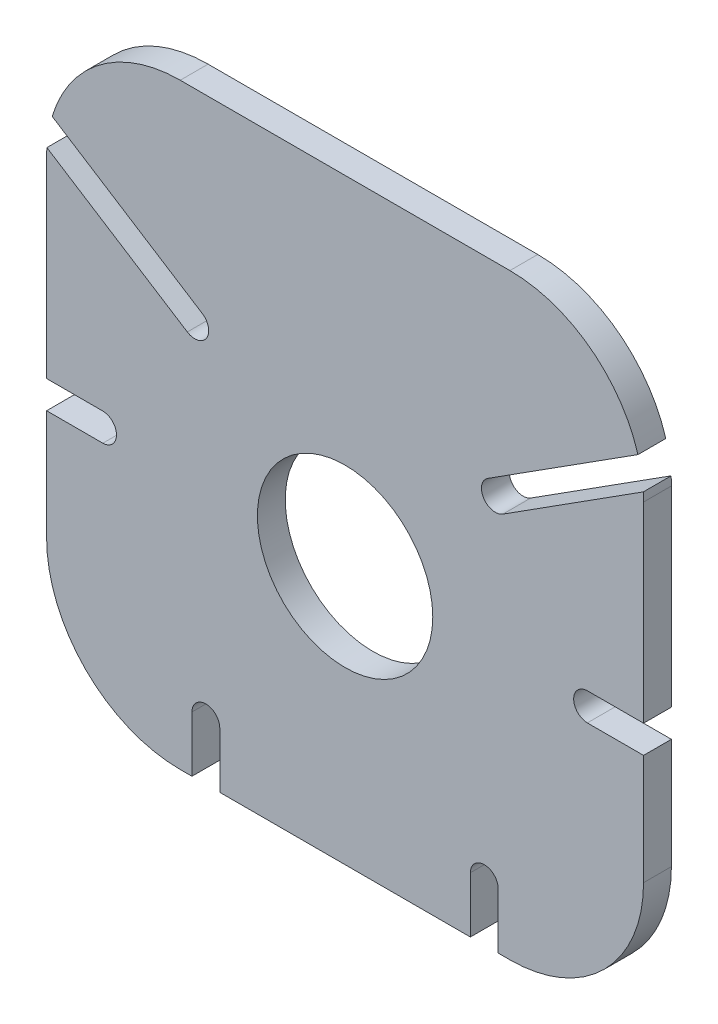
ISO-10303-21;
HEADER;
FILE_DESCRIPTION(('STEP AP214'),'2;1');
FILE_NAME('part.step','',(''),(''),'','','');
FILE_SCHEMA(('AUTOMOTIVE_DESIGN { 1 0 10303 214 1 1 1 1 }'));
ENDSEC;
DATA;
#1=APPLICATION_CONTEXT('core data for automotive mechanical design processes');
#2=APPLICATION_PROTOCOL_DEFINITION('international standard','automotive_design',2000,#1);
#3=PRODUCT_CONTEXT('',#1,'mechanical');
#4=PRODUCT('Part','Part','',(#3));
#5=PRODUCT_RELATED_PRODUCT_CATEGORY('part','',(#4));
#6=PRODUCT_DEFINITION_FORMATION('','',#4);
#7=PRODUCT_DEFINITION_CONTEXT('part definition',#1,'design');
#8=PRODUCT_DEFINITION('design','',#6,#7);
#9=PRODUCT_DEFINITION_SHAPE('','',#8);
#10=(LENGTH_UNIT() NAMED_UNIT(*) SI_UNIT(.MILLI.,.METRE.));
#11=(NAMED_UNIT(*) PLANE_ANGLE_UNIT() SI_UNIT($,.RADIAN.));
#12=(NAMED_UNIT(*) SI_UNIT($,.STERADIAN.) SOLID_ANGLE_UNIT());
#13=UNCERTAINTY_MEASURE_WITH_UNIT(LENGTH_MEASURE(1.E-05),#10,'distance_accuracy_value','');
#14=(GEOMETRIC_REPRESENTATION_CONTEXT(3) GLOBAL_UNCERTAINTY_ASSIGNED_CONTEXT((#13)) GLOBAL_UNIT_ASSIGNED_CONTEXT((#10,
#11,#12)) REPRESENTATION_CONTEXT('',''));
#15=CARTESIAN_POINT('',(0.,0.,0.));
#16=DIRECTION('',(0.,0.,1.));
#17=DIRECTION('',(1.,0.,0.));
#18=AXIS2_PLACEMENT_3D('',#15,#16,#17);
#19=CARTESIAN_POINT('',(-9.398,9.398,1.5875));
#20=DIRECTION('',(0.,0.,1.));
#21=DIRECTION('',(1.,0.,0.));
#22=AXIS2_PLACEMENT_3D('',#19,#20,#21);
#23=PLANE('',#22);
#24=CARTESIAN_POINT('',(0.,-2.286,1.5875));
#25=DIRECTION('',(0.,0.,1.));
#26=DIRECTION('',(1.,0.,0.));
#27=AXIS2_PLACEMENT_3D('',#24,#25,#26);
#28=CIRCLE('',#27,5.);
#29=CARTESIAN_POINT('',(5.,-2.286,1.5875));
#30=VERTEX_POINT('',#29);
#31=EDGE_CURVE('E403',#30,#30,#28,.T.);
#32=ORIENTED_EDGE('',*,*,#31,.F.);
#33=EDGE_LOOP('',(#32));
#34=FACE_BOUND('',#33,.T.);
#35=DIRECTION('',(0.,-1.,0.));
#36=VECTOR('',#35,1.);
#37=CARTESIAN_POINT('',(-17.018,9.398,1.5875));
#38=LINE('',#37,#36);
#39=CARTESIAN_POINT('',(-17.018,9.398,1.5875));
#40=VERTEX_POINT('',#39);
#41=CARTESIAN_POINT('',(-17.018,-1.524,1.5875));
#42=VERTEX_POINT('',#41);
#43=EDGE_CURVE('E438',#40,#42,#38,.T.);
#44=ORIENTED_EDGE('',*,*,#43,.T.);
#45=DIRECTION('',(1.,0.,0.));
#46=VECTOR('',#45,1.);
#47=CARTESIAN_POINT('',(-17.018,-1.524,1.5875));
#48=LINE('',#47,#46);
#49=CARTESIAN_POINT('',(-13.843,-1.524,1.5875));
#50=VERTEX_POINT('',#49);
#51=EDGE_CURVE('E258',#42,#50,#48,.T.);
#52=ORIENTED_EDGE('',*,*,#51,.T.);
#53=CARTESIAN_POINT('',(-13.827125,-2.31775,1.5875));
#54=DIRECTION('',(0.,0.,-1.));
#55=DIRECTION('',(-1.,0.,0.));
#56=AXIS2_PLACEMENT_3D('',#53,#54,#55);
#57=CIRCLE('',#56,0.793908734128174);
#58=CARTESIAN_POINT('',(-13.81125,-3.1115,1.5875));
#59=VERTEX_POINT('',#58);
#60=EDGE_CURVE('E579',#50,#59,#57,.T.);
#61=ORIENTED_EDGE('',*,*,#60,.T.);
#62=DIRECTION('',(-1.,0.,0.));
#63=VECTOR('',#62,1.);
#64=CARTESIAN_POINT('',(-17.018,-3.1115,1.5875));
#65=LINE('',#64,#63);
#66=CARTESIAN_POINT('',(-17.018,-3.1115,1.5875));
#67=VERTEX_POINT('',#66);
#68=EDGE_CURVE('E274',#59,#67,#65,.T.);
#69=ORIENTED_EDGE('',*,*,#68,.T.);
#70=CARTESIAN_POINT('',(-17.018,-9.39800000000001,1.5875));
#71=VERTEX_POINT('',#70);
#72=EDGE_CURVE('E441',#67,#71,#38,.T.);
#73=ORIENTED_EDGE('',*,*,#72,.T.);
#74=CARTESIAN_POINT('',(-9.398,-9.39800000000001,1.5875));
#75=DIRECTION('',(0.,0.,1.));
#76=DIRECTION('',(1.,0.,0.));
#77=AXIS2_PLACEMENT_3D('',#74,#75,#76);
#78=CIRCLE('',#77,7.62);
#79=CARTESIAN_POINT('',(-9.398,-17.018,1.5875));
#80=VERTEX_POINT('',#79);
#81=EDGE_CURVE('E435',#71,#80,#78,.T.);
#82=ORIENTED_EDGE('',*,*,#81,.T.);
#83=DIRECTION('',(1.,0.,0.));
#84=VECTOR('',#83,1.);
#85=CARTESIAN_POINT('',(9.39800000000001,-17.018,1.5875));
#86=LINE('',#85,#84);
#87=CARTESIAN_POINT('',(-8.73125,-17.018,1.5875));
#88=VERTEX_POINT('',#87);
#89=EDGE_CURVE('E429',#80,#88,#86,.T.);
#90=ORIENTED_EDGE('',*,*,#89,.T.);
#91=DIRECTION('',(0.,-1.,0.));
#92=VECTOR('',#91,1.);
#93=CARTESIAN_POINT('',(-8.73125,-17.018,1.5875));
#94=LINE('',#93,#92);
#95=CARTESIAN_POINT('',(-8.73125,-13.843,1.5875));
#96=VERTEX_POINT('',#95);
#97=EDGE_CURVE('E484',#96,#88,#94,.T.);
#98=ORIENTED_EDGE('',*,*,#97,.F.);
#99=CARTESIAN_POINT('',(-7.9375,-13.843,1.5875));
#100=DIRECTION('',(0.,0.,1.));
#101=DIRECTION('',(-1.,0.,0.));
#102=AXIS2_PLACEMENT_3D('',#99,#100,#101);
#103=CIRCLE('',#102,0.79375);
#104=CARTESIAN_POINT('',(-7.14375,-13.843,1.5875));
#105=VERTEX_POINT('',#104);
#106=EDGE_CURVE('E469',#105,#96,#103,.T.);
#107=ORIENTED_EDGE('',*,*,#106,.F.);
#108=DIRECTION('',(0.,1.,0.));
#109=VECTOR('',#108,1.);
#110=CARTESIAN_POINT('',(-7.14375,-17.018,1.5875));
#111=LINE('',#110,#109);
#112=CARTESIAN_POINT('',(-7.14375,-17.018,1.5875));
#113=VERTEX_POINT('',#112);
#114=EDGE_CURVE('E480',#113,#105,#111,.T.);
#115=ORIENTED_EDGE('',*,*,#114,.F.);
#116=CARTESIAN_POINT('',(7.14375,-17.018,1.5875));
#117=VERTEX_POINT('',#116);
#118=EDGE_CURVE('E433',#113,#117,#86,.T.);
#119=ORIENTED_EDGE('',*,*,#118,.T.);
#120=DIRECTION('',(0.,-1.,0.));
#121=VECTOR('',#120,1.);
#122=CARTESIAN_POINT('',(7.14375,-17.018,1.5875));
#123=LINE('',#122,#121);
#124=CARTESIAN_POINT('',(7.14375,-13.843,1.5875));
#125=VERTEX_POINT('',#124);
#126=EDGE_CURVE('E507',#125,#117,#123,.T.);
#127=ORIENTED_EDGE('',*,*,#126,.F.);
#128=CARTESIAN_POINT('',(7.9375,-13.843,1.5875));
#129=DIRECTION('',(0.,0.,1.));
#130=DIRECTION('',(-1.,0.,0.));
#131=AXIS2_PLACEMENT_3D('',#128,#129,#130);
#132=CIRCLE('',#131,0.79375);
#133=CARTESIAN_POINT('',(8.73125,-13.843,1.5875));
#134=VERTEX_POINT('',#133);
#135=EDGE_CURVE('E518',#134,#125,#132,.T.);
#136=ORIENTED_EDGE('',*,*,#135,.F.);
#137=DIRECTION('',(0.,1.,0.));
#138=VECTOR('',#137,1.);
#139=CARTESIAN_POINT('',(8.73125,-17.018,1.5875));
#140=LINE('',#139,#138);
#141=CARTESIAN_POINT('',(8.73125,-17.018,1.5875));
#142=VERTEX_POINT('',#141);
#143=EDGE_CURVE('E522',#142,#134,#140,.T.);
#144=ORIENTED_EDGE('',*,*,#143,.F.);
#145=CARTESIAN_POINT('',(9.398,-17.018,1.5875));
#146=VERTEX_POINT('',#145);
#147=EDGE_CURVE('E434',#142,#146,#86,.T.);
#148=ORIENTED_EDGE('',*,*,#147,.T.);
#149=CARTESIAN_POINT('',(9.39800000000001,-9.39800000000001,1.5875));
#150=DIRECTION('',(0.,0.,1.));
#151=DIRECTION('',(1.,0.,0.));
#152=AXIS2_PLACEMENT_3D('',#149,#150,#151);
#153=CIRCLE('',#152,7.62);
#154=CARTESIAN_POINT('',(17.018,-9.39800000000001,1.5875));
#155=VERTEX_POINT('',#154);
#156=EDGE_CURVE('E426',#146,#155,#153,.T.);
#157=ORIENTED_EDGE('',*,*,#156,.T.);
#158=DIRECTION('',(0.,1.,0.));
#159=VECTOR('',#158,1.);
#160=CARTESIAN_POINT('',(17.018,9.398,1.5875));
#161=LINE('',#160,#159);
#162=CARTESIAN_POINT('',(17.018,-3.1115,1.5875));
#163=VERTEX_POINT('',#162);
#164=EDGE_CURVE('E421',#155,#163,#161,.T.);
#165=ORIENTED_EDGE('',*,*,#164,.T.);
#166=DIRECTION('',(1.,0.,0.));
#167=VECTOR('',#166,1.);
#168=CARTESIAN_POINT('',(17.018,-3.1115,1.5875));
#169=LINE('',#168,#167);
#170=CARTESIAN_POINT('',(13.81125,-3.1115,1.5875));
#171=VERTEX_POINT('',#170);
#172=EDGE_CURVE('E540',#171,#163,#169,.T.);
#173=ORIENTED_EDGE('',*,*,#172,.F.);
#174=CARTESIAN_POINT('',(13.827125,-2.31775,1.5875));
#175=DIRECTION('',(0.,0.,1.));
#176=DIRECTION('',(1.,0.,0.));
#177=AXIS2_PLACEMENT_3D('',#174,#175,#176);
#178=CIRCLE('',#177,0.793908734128174);
#179=CARTESIAN_POINT('',(13.843,-1.524,1.5875));
#180=VERTEX_POINT('',#179);
#181=EDGE_CURVE('E551',#180,#171,#178,.T.);
#182=ORIENTED_EDGE('',*,*,#181,.F.);
#183=DIRECTION('',(-1.,0.,0.));
#184=VECTOR('',#183,1.);
#185=CARTESIAN_POINT('',(17.018,-1.524,1.5875));
#186=LINE('',#185,#184);
#187=CARTESIAN_POINT('',(17.018,-1.524,1.5875));
#188=VERTEX_POINT('',#187);
#189=EDGE_CURVE('E555',#188,#180,#186,.T.);
#190=ORIENTED_EDGE('',*,*,#189,.F.);
#191=CARTESIAN_POINT('',(17.018,9.398,1.5875));
#192=VERTEX_POINT('',#191);
#193=EDGE_CURVE('E425',#188,#192,#161,.T.);
#194=ORIENTED_EDGE('',*,*,#193,.T.);
#195=CARTESIAN_POINT('',(9.398,9.398,1.5875));
#196=DIRECTION('',(0.,0.,1.));
#197=DIRECTION('',(1.,0.,0.));
#198=AXIS2_PLACEMENT_3D('',#195,#196,#197);
#199=CIRCLE('',#198,7.62);
#200=CARTESIAN_POINT('',(17.0020756056577,9.89037605896414,1.5875));
#201=VERTEX_POINT('',#200);
#202=EDGE_CURVE('E418',#192,#201,#199,.T.);
#203=ORIENTED_EDGE('',*,*,#202,.T.);
#204=DIRECTION('',(-0.843391445812889,-0.537299608346819,0.));
#205=VECTOR('',#204,1.);
#206=CARTESIAN_POINT('',(17.0020756056577,9.89037605896414,1.5875));
#207=LINE('',#206,#205);
#208=CARTESIAN_POINT('',(8.99533865358422,4.78952206068973,1.5875));
#209=VERTEX_POINT('',#208);
#210=EDGE_CURVE('E415',#201,#209,#207,.T.);
#211=ORIENTED_EDGE('',*,*,#210,.T.);
#212=CARTESIAN_POINT('',(8.56885708945893,5.45896402080371,1.5875));
#213=DIRECTION('',(0.,0.,-1.));
#214=DIRECTION('',(1.,0.,0.));
#215=AXIS2_PLACEMENT_3D('',#212,#213,#214);
#216=CIRCLE('',#215,0.793750000000002);
#217=CARTESIAN_POINT('',(8.14237552533363,6.1284059809177,1.5875));
#218=VERTEX_POINT('',#217);
#219=EDGE_CURVE('E412',#209,#218,#216,.T.);
#220=ORIENTED_EDGE('',*,*,#219,.T.);
#221=DIRECTION('',(0.843391445812889,0.537299608346819,0.));
#222=VECTOR('',#221,1.);
#223=CARTESIAN_POINT('',(8.14237552533363,6.1284059809177,1.5875));
#224=LINE('',#223,#222);
#225=CARTESIAN_POINT('',(16.6990299705643,11.5795960599803,1.5875));
#226=VERTEX_POINT('',#225);
#227=EDGE_CURVE('E409',#218,#226,#224,.T.);
#228=ORIENTED_EDGE('',*,*,#227,.T.);
#229=CARTESIAN_POINT('',(9.398,9.398,1.5875));
#230=DIRECTION('',(0.,0.,1.));
#231=DIRECTION('',(1.,0.,0.));
#232=AXIS2_PLACEMENT_3D('',#229,#230,#231);
#233=CIRCLE('',#232,7.62);
#234=CARTESIAN_POINT('',(9.398,17.018,1.5875));
#235=VERTEX_POINT('',#234);
#236=EDGE_CURVE('E406',#226,#235,#233,.T.);
#237=ORIENTED_EDGE('',*,*,#236,.T.);
#238=DIRECTION('',(-1.,0.,0.));
#239=VECTOR('',#238,1.);
#240=CARTESIAN_POINT('',(9.398,17.018,1.5875));
#241=LINE('',#240,#239);
#242=CARTESIAN_POINT('',(-9.39800000000001,17.018,1.5875));
#243=VERTEX_POINT('',#242);
#244=EDGE_CURVE('E329',#235,#243,#241,.T.);
#245=ORIENTED_EDGE('',*,*,#244,.T.);
#246=CARTESIAN_POINT('',(-9.398,9.398,1.5875));
#247=DIRECTION('',(0.,0.,1.));
#248=DIRECTION('',(1.,0.,0.));
#249=AXIS2_PLACEMENT_3D('',#246,#247,#248);
#250=CIRCLE('',#249,7.62);
#251=CARTESIAN_POINT('',(-16.6990299705643,11.5795960599803,1.5875));
#252=VERTEX_POINT('',#251);
#253=EDGE_CURVE('E323',#243,#252,#250,.T.);
#254=ORIENTED_EDGE('',*,*,#253,.T.);
#255=DIRECTION('',(0.843391445812888,-0.537299608346821,0.));
#256=VECTOR('',#255,1.);
#257=CARTESIAN_POINT('',(-8.14237552533365,6.12840598091768,1.5875));
#258=LINE('',#257,#256);
#259=CARTESIAN_POINT('',(-8.14237552533365,6.12840598091768,1.5875));
#260=VERTEX_POINT('',#259);
#261=EDGE_CURVE('E450',#252,#260,#258,.T.);
#262=ORIENTED_EDGE('',*,*,#261,.T.);
#263=CARTESIAN_POINT('',(-8.56885708945894,5.4589640208037,1.5875));
#264=DIRECTION('',(0.,0.,-1.));
#265=DIRECTION('',(-1.,0.,0.));
#266=AXIS2_PLACEMENT_3D('',#263,#264,#265);
#267=CIRCLE('',#266,0.793749999999999);
#268=CARTESIAN_POINT('',(-8.99533865358422,4.78952206068972,1.5875));
#269=VERTEX_POINT('',#268);
#270=EDGE_CURVE('E387',#260,#269,#267,.T.);
#271=ORIENTED_EDGE('',*,*,#270,.T.);
#272=DIRECTION('',(-0.843391445812888,0.537299608346821,0.));
#273=VECTOR('',#272,1.);
#274=CARTESIAN_POINT('',(-17.0020756056577,9.89037605896414,1.5875));
#275=LINE('',#274,#273);
#276=CARTESIAN_POINT('',(-17.0020756056577,9.89037605896414,1.5875));
#277=VERTEX_POINT('',#276);
#278=EDGE_CURVE('E445',#269,#277,#275,.T.);
#279=ORIENTED_EDGE('',*,*,#278,.T.);
#280=CARTESIAN_POINT('',(-9.398,9.398,1.5875));
#281=DIRECTION('',(0.,0.,1.));
#282=DIRECTION('',(1.,0.,0.));
#283=AXIS2_PLACEMENT_3D('',#280,#281,#282);
#284=CIRCLE('',#283,7.62);
#285=EDGE_CURVE('E442',#277,#40,#284,.T.);
#286=ORIENTED_EDGE('',*,*,#285,.T.);
#287=EDGE_LOOP('',(#44,#52,#61,#69,#73,#82,#90,#98,#107,#115,#119,#127,#136,#144,#148,#157,#165,
#173,#182,#190,#194,#203,#211,#220,#228,#237,#245,#254,#262,#271,#279,#286));
#288=FACE_BOUND('',#287,.T.);
#289=ADVANCED_FACE('F42',(#34,#288),#23,.T.);
#290=CARTESIAN_POINT('',(-9.398,9.398,0.));
#291=DIRECTION('',(0.,0.,1.));
#292=DIRECTION('',(1.,0.,0.));
#293=AXIS2_PLACEMENT_3D('',#290,#291,#292);
#294=PLANE('',#293);
#295=CARTESIAN_POINT('',(0.,-2.286,0.));
#296=DIRECTION('',(0.,0.,1.));
#297=DIRECTION('',(1.,0.,0.));
#298=AXIS2_PLACEMENT_3D('',#295,#296,#297);
#299=CIRCLE('',#298,5.);
#300=CARTESIAN_POINT('',(5.,-2.286,0.));
#301=VERTEX_POINT('',#300);
#302=EDGE_CURVE('E456',#301,#301,#299,.T.);
#303=ORIENTED_EDGE('',*,*,#302,.T.);
#304=EDGE_LOOP('',(#303));
#305=FACE_BOUND('',#304,.T.);
#306=DIRECTION('',(-1.,0.,0.));
#307=VECTOR('',#306,1.);
#308=CARTESIAN_POINT('',(-17.018,-1.524,0.));
#309=LINE('',#308,#307);
#310=CARTESIAN_POINT('',(-13.843,-1.524,0.));
#311=VERTEX_POINT('',#310);
#312=CARTESIAN_POINT('',(-17.018,-1.524,0.));
#313=VERTEX_POINT('',#312);
#314=EDGE_CURVE('E255',#311,#313,#309,.T.);
#315=ORIENTED_EDGE('',*,*,#314,.T.);
#316=DIRECTION('',(0.,-1.,0.));
#317=VECTOR('',#316,1.);
#318=CARTESIAN_POINT('',(-17.018,9.398,0.));
#319=LINE('',#318,#317);
#320=CARTESIAN_POINT('',(-17.018,9.398,0.));
#321=VERTEX_POINT('',#320);
#322=EDGE_CURVE('E271',#321,#313,#319,.T.);
#323=ORIENTED_EDGE('',*,*,#322,.F.);
#324=CARTESIAN_POINT('',(-9.398,9.398,0.));
#325=DIRECTION('',(0.,0.,1.));
#326=DIRECTION('',(1.,0.,0.));
#327=AXIS2_PLACEMENT_3D('',#324,#325,#326);
#328=CIRCLE('',#327,7.62);
#329=CARTESIAN_POINT('',(-17.0020756056577,9.89037605896414,0.));
#330=VERTEX_POINT('',#329);
#331=EDGE_CURVE('E288',#330,#321,#328,.T.);
#332=ORIENTED_EDGE('',*,*,#331,.F.);
#333=DIRECTION('',(-0.843391445812888,0.537299608346821,0.));
#334=VECTOR('',#333,1.);
#335=CARTESIAN_POINT('',(-17.0020756056577,9.89037605896414,0.));
#336=LINE('',#335,#334);
#337=CARTESIAN_POINT('',(-8.99533865358422,4.78952206068972,0.));
#338=VERTEX_POINT('',#337);
#339=EDGE_CURVE('E392',#338,#330,#336,.T.);
#340=ORIENTED_EDGE('',*,*,#339,.F.);
#341=CARTESIAN_POINT('',(-8.56885708945894,5.4589640208037,0.));
#342=DIRECTION('',(0.,0.,-1.));
#343=DIRECTION('',(-1.,0.,0.));
#344=AXIS2_PLACEMENT_3D('',#341,#342,#343);
#345=CIRCLE('',#344,0.793749999999999);
#346=CARTESIAN_POINT('',(-8.14237552533365,6.12840598091768,0.));
#347=VERTEX_POINT('',#346);
#348=EDGE_CURVE('E386',#347,#338,#345,.T.);
#349=ORIENTED_EDGE('',*,*,#348,.F.);
#350=DIRECTION('',(0.843391445812888,-0.537299608346821,0.));
#351=VECTOR('',#350,1.);
#352=CARTESIAN_POINT('',(-8.14237552533365,6.12840598091768,0.));
#353=LINE('',#352,#351);
#354=CARTESIAN_POINT('',(-16.6990299705643,11.5795960599803,0.));
#355=VERTEX_POINT('',#354);
#356=EDGE_CURVE('E391',#355,#347,#353,.T.);
#357=ORIENTED_EDGE('',*,*,#356,.F.);
#358=CARTESIAN_POINT('',(-9.398,9.398,0.));
#359=DIRECTION('',(0.,0.,1.));
#360=DIRECTION('',(1.,0.,0.));
#361=AXIS2_PLACEMENT_3D('',#358,#359,#360);
#362=CIRCLE('',#361,7.62);
#363=CARTESIAN_POINT('',(-9.39800000000001,17.018,0.));
#364=VERTEX_POINT('',#363);
#365=EDGE_CURVE('E397',#364,#355,#362,.T.);
#366=ORIENTED_EDGE('',*,*,#365,.F.);
#367=DIRECTION('',(-1.,0.,0.));
#368=VECTOR('',#367,1.);
#369=CARTESIAN_POINT('',(9.398,17.018,0.));
#370=LINE('',#369,#368);
#371=CARTESIAN_POINT('',(9.398,17.018,0.));
#372=VERTEX_POINT('',#371);
#373=EDGE_CURVE('E320',#372,#364,#370,.T.);
#374=ORIENTED_EDGE('',*,*,#373,.F.);
#375=CARTESIAN_POINT('',(9.398,9.398,0.));
#376=DIRECTION('',(0.,0.,1.));
#377=DIRECTION('',(1.,0.,0.));
#378=AXIS2_PLACEMENT_3D('',#375,#376,#377);
#379=CIRCLE('',#378,7.62);
#380=CARTESIAN_POINT('',(16.6990299705643,11.5795960599803,0.));
#381=VERTEX_POINT('',#380);
#382=EDGE_CURVE('E317',#381,#372,#379,.T.);
#383=ORIENTED_EDGE('',*,*,#382,.F.);
#384=DIRECTION('',(0.843391445812889,0.537299608346819,0.));
#385=VECTOR('',#384,1.);
#386=CARTESIAN_POINT('',(8.14237552533363,6.1284059809177,0.));
#387=LINE('',#386,#385);
#388=CARTESIAN_POINT('',(8.14237552533363,6.1284059809177,0.));
#389=VERTEX_POINT('',#388);
#390=EDGE_CURVE('E314',#389,#381,#387,.T.);
#391=ORIENTED_EDGE('',*,*,#390,.F.);
#392=CARTESIAN_POINT('',(8.56885708945893,5.45896402080371,0.));
#393=DIRECTION('',(0.,0.,-1.));
#394=DIRECTION('',(1.,0.,0.));
#395=AXIS2_PLACEMENT_3D('',#392,#393,#394);
#396=CIRCLE('',#395,0.793750000000002);
#397=CARTESIAN_POINT('',(8.99533865358422,4.78952206068973,0.));
#398=VERTEX_POINT('',#397);
#399=EDGE_CURVE('E311',#398,#389,#396,.T.);
#400=ORIENTED_EDGE('',*,*,#399,.F.);
#401=DIRECTION('',(-0.843391445812889,-0.537299608346819,0.));
#402=VECTOR('',#401,1.);
#403=CARTESIAN_POINT('',(17.0020756056577,9.89037605896414,0.));
#404=LINE('',#403,#402);
#405=CARTESIAN_POINT('',(17.0020756056577,9.89037605896414,0.));
#406=VERTEX_POINT('',#405);
#407=EDGE_CURVE('E308',#406,#398,#404,.T.);
#408=ORIENTED_EDGE('',*,*,#407,.F.);
#409=CARTESIAN_POINT('',(9.398,9.398,0.));
#410=DIRECTION('',(0.,0.,1.));
#411=DIRECTION('',(1.,0.,0.));
#412=AXIS2_PLACEMENT_3D('',#409,#410,#411);
#413=CIRCLE('',#412,7.62);
#414=CARTESIAN_POINT('',(17.018,9.398,0.));
#415=VERTEX_POINT('',#414);
#416=EDGE_CURVE('E305',#415,#406,#413,.T.);
#417=ORIENTED_EDGE('',*,*,#416,.F.);
#418=DIRECTION('',(0.,1.,0.));
#419=VECTOR('',#418,1.);
#420=CARTESIAN_POINT('',(17.018,9.398,0.));
#421=LINE('',#420,#419);
#422=CARTESIAN_POINT('',(17.018,-1.524,0.));
#423=VERTEX_POINT('',#422);
#424=EDGE_CURVE('E300',#423,#415,#421,.T.);
#425=ORIENTED_EDGE('',*,*,#424,.F.);
#426=DIRECTION('',(1.,0.,0.));
#427=VECTOR('',#426,1.);
#428=CARTESIAN_POINT('',(17.018,-1.524,0.));
#429=LINE('',#428,#427);
#430=CARTESIAN_POINT('',(13.843,-1.524,0.));
#431=VERTEX_POINT('',#430);
#432=EDGE_CURVE('E66',#431,#423,#429,.T.);
#433=ORIENTED_EDGE('',*,*,#432,.F.);
#434=CARTESIAN_POINT('',(13.827125,-2.31775,0.));
#435=DIRECTION('',(0.,0.,1.));
#436=DIRECTION('',(1.,0.,0.));
#437=AXIS2_PLACEMENT_3D('',#434,#435,#436);
#438=CIRCLE('',#437,0.793908734128174);
#439=CARTESIAN_POINT('',(13.81125,-3.1115,0.));
#440=VERTEX_POINT('',#439);
#441=EDGE_CURVE('E563',#440,#431,#438,.F.);
#442=ORIENTED_EDGE('',*,*,#441,.F.);
#443=DIRECTION('',(-1.,0.,0.));
#444=VECTOR('',#443,1.);
#445=CARTESIAN_POINT('',(17.018,-3.1115,0.));
#446=LINE('',#445,#444);
#447=CARTESIAN_POINT('',(17.018,-3.1115,0.));
#448=VERTEX_POINT('',#447);
#449=EDGE_CURVE('E559',#448,#440,#446,.T.);
#450=ORIENTED_EDGE('',*,*,#449,.F.);
#451=CARTESIAN_POINT('',(17.018,-9.39800000000001,0.));
#452=VERTEX_POINT('',#451);
#453=EDGE_CURVE('E301',#452,#448,#421,.T.);
#454=ORIENTED_EDGE('',*,*,#453,.F.);
#455=CARTESIAN_POINT('',(9.39800000000001,-9.39800000000001,0.));
#456=DIRECTION('',(0.,0.,1.));
#457=DIRECTION('',(1.,0.,0.));
#458=AXIS2_PLACEMENT_3D('',#455,#456,#457);
#459=CIRCLE('',#458,7.62);
#460=CARTESIAN_POINT('',(9.398,-17.018,0.));
#461=VERTEX_POINT('',#460);
#462=EDGE_CURVE('E296',#461,#452,#459,.T.);
#463=ORIENTED_EDGE('',*,*,#462,.F.);
#464=DIRECTION('',(1.,0.,0.));
#465=VECTOR('',#464,1.);
#466=CARTESIAN_POINT('',(9.39800000000001,-17.018,0.));
#467=LINE('',#466,#465);
#468=CARTESIAN_POINT('',(8.73125,-17.018,0.));
#469=VERTEX_POINT('',#468);
#470=EDGE_CURVE('E286',#469,#461,#467,.T.);
#471=ORIENTED_EDGE('',*,*,#470,.F.);
#472=DIRECTION('',(0.,-1.,0.));
#473=VECTOR('',#472,1.);
#474=CARTESIAN_POINT('',(8.73125,-17.018,0.));
#475=LINE('',#474,#473);
#476=CARTESIAN_POINT('',(8.73125,-13.843,0.));
#477=VERTEX_POINT('',#476);
#478=EDGE_CURVE('E526',#477,#469,#475,.T.);
#479=ORIENTED_EDGE('',*,*,#478,.F.);
#480=CARTESIAN_POINT('',(7.9375,-13.843,0.));
#481=DIRECTION('',(0.,0.,1.));
#482=DIRECTION('',(1.,0.,0.));
#483=AXIS2_PLACEMENT_3D('',#480,#481,#482);
#484=CIRCLE('',#483,0.79375);
#485=CARTESIAN_POINT('',(7.14375,-13.843,0.));
#486=VERTEX_POINT('',#485);
#487=EDGE_CURVE('E498',#486,#477,#484,.F.);
#488=ORIENTED_EDGE('',*,*,#487,.F.);
#489=DIRECTION('',(0.,1.,0.));
#490=VECTOR('',#489,1.);
#491=CARTESIAN_POINT('',(7.14375,-17.018,0.));
#492=LINE('',#491,#490);
#493=CARTESIAN_POINT('',(7.14375,-17.018,0.));
#494=VERTEX_POINT('',#493);
#495=EDGE_CURVE('E529',#494,#486,#492,.T.);
#496=ORIENTED_EDGE('',*,*,#495,.F.);
#497=CARTESIAN_POINT('',(-7.14375,-17.018,0.));
#498=VERTEX_POINT('',#497);
#499=EDGE_CURVE('E297',#498,#494,#467,.T.);
#500=ORIENTED_EDGE('',*,*,#499,.F.);
#501=DIRECTION('',(0.,-1.,0.));
#502=VECTOR('',#501,1.);
#503=CARTESIAN_POINT('',(-7.14375,-17.018,0.));
#504=LINE('',#503,#502);
#505=CARTESIAN_POINT('',(-7.14375,-13.843,0.));
#506=VERTEX_POINT('',#505);
#507=EDGE_CURVE('E495',#506,#498,#504,.T.);
#508=ORIENTED_EDGE('',*,*,#507,.F.);
#509=CARTESIAN_POINT('',(-7.9375,-13.843,0.));
#510=DIRECTION('',(0.,0.,1.));
#511=DIRECTION('',(1.,0.,0.));
#512=AXIS2_PLACEMENT_3D('',#509,#510,#511);
#513=CIRCLE('',#512,0.79375);
#514=CARTESIAN_POINT('',(-8.73125,-13.843,0.));
#515=VERTEX_POINT('',#514);
#516=EDGE_CURVE('E491',#515,#506,#513,.F.);
#517=ORIENTED_EDGE('',*,*,#516,.F.);
#518=DIRECTION('',(0.,1.,0.));
#519=VECTOR('',#518,1.);
#520=CARTESIAN_POINT('',(-8.73125,-17.018,0.));
#521=LINE('',#520,#519);
#522=CARTESIAN_POINT('',(-8.73125,-17.018,0.));
#523=VERTEX_POINT('',#522);
#524=EDGE_CURVE('E487',#523,#515,#521,.T.);
#525=ORIENTED_EDGE('',*,*,#524,.F.);
#526=CARTESIAN_POINT('',(-9.398,-17.018,0.));
#527=VERTEX_POINT('',#526);
#528=EDGE_CURVE('E292',#527,#523,#467,.T.);
#529=ORIENTED_EDGE('',*,*,#528,.F.);
#530=CARTESIAN_POINT('',(-9.398,-9.39800000000001,0.));
#531=DIRECTION('',(0.,0.,1.));
#532=DIRECTION('',(1.,0.,0.));
#533=AXIS2_PLACEMENT_3D('',#530,#531,#532);
#534=CIRCLE('',#533,7.62);
#535=CARTESIAN_POINT('',(-17.018,-9.39800000000001,0.));
#536=VERTEX_POINT('',#535);
#537=EDGE_CURVE('E281',#536,#527,#534,.T.);
#538=ORIENTED_EDGE('',*,*,#537,.F.);
#539=CARTESIAN_POINT('',(-17.018,-3.1115,0.));
#540=VERTEX_POINT('',#539);
#541=EDGE_CURVE('E282',#540,#536,#319,.T.);
#542=ORIENTED_EDGE('',*,*,#541,.F.);
#543=DIRECTION('',(1.,0.,0.));
#544=VECTOR('',#543,1.);
#545=CARTESIAN_POINT('',(-17.018,-3.1115,0.));
#546=LINE('',#545,#544);
#547=CARTESIAN_POINT('',(-13.81125,-3.1115,0.));
#548=VERTEX_POINT('',#547);
#549=EDGE_CURVE('E58',#540,#548,#546,.T.);
#550=ORIENTED_EDGE('',*,*,#549,.T.);
#551=CARTESIAN_POINT('',(-13.827125,-2.31775,0.));
#552=DIRECTION('',(0.,0.,1.));
#553=DIRECTION('',(1.,0.,0.));
#554=AXIS2_PLACEMENT_3D('',#551,#552,#553);
#555=CIRCLE('',#554,0.793908734128174);
#556=EDGE_CURVE('E272',#548,#311,#555,.T.);
#557=ORIENTED_EDGE('',*,*,#556,.T.);
#558=EDGE_LOOP('',(#315,#323,#332,#340,#349,#357,#366,#374,#383,#391,#400,#408,#417,#425,#433,
#442,#450,#454,#463,#471,#479,#488,#496,#500,#508,#517,#525,#529,#538,#542,#550,#557));
#559=FACE_BOUND('',#558,.T.);
#560=ADVANCED_FACE('F269',(#305,#559),#294,.F.);
#561=CARTESIAN_POINT('',(-17.018,9.398,1.5875));
#562=DIRECTION('',(1.,0.,0.));
#563=DIRECTION('',(0.,1.,0.));
#564=AXIS2_PLACEMENT_3D('',#561,#562,#563);
#565=PLANE('',#564);
#566=DIRECTION('',(0.,0.,1.));
#567=VECTOR('',#566,1.);
#568=CARTESIAN_POINT('',(-17.018,-1.524,-0.000999999999999916));
#569=LINE('',#568,#567);
#570=EDGE_CURVE('E252',#313,#42,#569,.T.);
#571=ORIENTED_EDGE('',*,*,#570,.T.);
#572=ORIENTED_EDGE('',*,*,#43,.F.);
#573=DIRECTION('',(0.,0.,-1.));
#574=VECTOR('',#573,1.);
#575=CARTESIAN_POINT('',(-17.018,9.398,1.5875));
#576=LINE('',#575,#574);
#577=EDGE_CURVE('E279',#40,#321,#576,.T.);
#578=ORIENTED_EDGE('',*,*,#577,.T.);
#579=ORIENTED_EDGE('',*,*,#322,.T.);
#580=EDGE_LOOP('',(#571,#572,#578,#579));
#581=FACE_BOUND('',#580,.T.);
#582=ADVANCED_FACE('F277',(#581),#565,.F.);
#583=DIRECTION('',(0.,0.,1.));
#584=VECTOR('',#583,1.);
#585=CARTESIAN_POINT('',(-17.018,-3.1115,-0.000999999999999916));
#586=LINE('',#585,#584);
#587=EDGE_CURVE('E569',#540,#67,#586,.T.);
#588=ORIENTED_EDGE('',*,*,#587,.F.);
#589=ORIENTED_EDGE('',*,*,#541,.T.);
#590=DIRECTION('',(0.,0.,-1.));
#591=VECTOR('',#590,1.);
#592=CARTESIAN_POINT('',(-17.018,-9.39800000000001,1.5875));
#593=LINE('',#592,#591);
#594=EDGE_CURVE('E365',#71,#536,#593,.T.);
#595=ORIENTED_EDGE('',*,*,#594,.F.);
#596=ORIENTED_EDGE('',*,*,#72,.F.);
#597=EDGE_LOOP('',(#588,#589,#595,#596));
#598=FACE_BOUND('',#597,.T.);
#599=ADVANCED_FACE('F593',(#598),#565,.F.);
#600=CARTESIAN_POINT('',(17.018,9.398,1.5875));
#601=DIRECTION('',(-1.,0.,0.));
#602=DIRECTION('',(0.,-1.,0.));
#603=AXIS2_PLACEMENT_3D('',#600,#601,#602);
#604=PLANE('',#603);
#605=ORIENTED_EDGE('',*,*,#453,.T.);
#606=DIRECTION('',(0.,0.,1.));
#607=VECTOR('',#606,1.);
#608=CARTESIAN_POINT('',(17.018,-3.1115,-0.000999999999999916));
#609=LINE('',#608,#607);
#610=EDGE_CURVE('E535',#448,#163,#609,.T.);
#611=ORIENTED_EDGE('',*,*,#610,.T.);
#612=ORIENTED_EDGE('',*,*,#164,.F.);
#613=DIRECTION('',(0.,0.,-1.));
#614=VECTOR('',#613,1.);
#615=CARTESIAN_POINT('',(17.018,-9.39800000000001,1.5875));
#616=LINE('',#615,#614);
#617=EDGE_CURVE('E353',#155,#452,#616,.T.);
#618=ORIENTED_EDGE('',*,*,#617,.T.);
#619=EDGE_LOOP('',(#605,#611,#612,#618));
#620=FACE_BOUND('',#619,.T.);
#621=ADVANCED_FACE('F617',(#620),#604,.F.);
#622=CARTESIAN_POINT('',(9.39800000000001,-17.018,1.5875));
#623=DIRECTION('',(0.,1.,0.));
#624=DIRECTION('',(0.,0.,1.));
#625=AXIS2_PLACEMENT_3D('',#622,#623,#624);
#626=PLANE('',#625);
#627=ORIENTED_EDGE('',*,*,#147,.F.);
#628=DIRECTION('',(0.,0.,1.));
#629=VECTOR('',#628,1.);
#630=CARTESIAN_POINT('',(8.73125,-17.018,-0.000999999999999916));
#631=LINE('',#630,#629);
#632=EDGE_CURVE('E502',#469,#142,#631,.T.);
#633=ORIENTED_EDGE('',*,*,#632,.F.);
#634=ORIENTED_EDGE('',*,*,#470,.T.);
#635=DIRECTION('',(0.,0.,-1.));
#636=VECTOR('',#635,1.);
#637=CARTESIAN_POINT('',(9.398,-17.018,1.5875));
#638=LINE('',#637,#636);
#639=EDGE_CURVE('E357',#146,#461,#638,.T.);
#640=ORIENTED_EDGE('',*,*,#639,.F.);
#641=EDGE_LOOP('',(#627,#633,#634,#640));
#642=FACE_BOUND('',#641,.T.);
#643=ADVANCED_FACE('F606',(#642),#626,.F.);
#644=ORIENTED_EDGE('',*,*,#528,.T.);
#645=DIRECTION('',(0.,0.,1.));
#646=VECTOR('',#645,1.);
#647=CARTESIAN_POINT('',(-8.73125,-17.018,-0.000999999999999916));
#648=LINE('',#647,#646);
#649=EDGE_CURVE('E464',#523,#88,#648,.T.);
#650=ORIENTED_EDGE('',*,*,#649,.T.);
#651=ORIENTED_EDGE('',*,*,#89,.F.);
#652=DIRECTION('',(0.,0.,-1.));
#653=VECTOR('',#652,1.);
#654=CARTESIAN_POINT('',(-9.398,-17.018,1.5875));
#655=LINE('',#654,#653);
#656=EDGE_CURVE('E361',#80,#527,#655,.T.);
#657=ORIENTED_EDGE('',*,*,#656,.T.);
#658=EDGE_LOOP('',(#644,#650,#651,#657));
#659=FACE_BOUND('',#658,.T.);
#660=ADVANCED_FACE('F702',(#659),#626,.F.);
#661=CARTESIAN_POINT('',(-9.398,9.398,1.5875));
#662=DIRECTION('',(0.,0.,-1.));
#663=DIRECTION('',(-1.,0.,0.));
#664=AXIS2_PLACEMENT_3D('',#661,#662,#663);
#665=CYLINDRICAL_SURFACE('',#664,7.62);
#666=ORIENTED_EDGE('',*,*,#365,.T.);
#667=DIRECTION('',(0.,0.,-1.));
#668=VECTOR('',#667,1.);
#669=CARTESIAN_POINT('',(-16.6990299705643,11.5795960599803,1.5875));
#670=LINE('',#669,#668);
#671=EDGE_CURVE('E11',#252,#355,#670,.T.);
#672=ORIENTED_EDGE('',*,*,#671,.F.);
#673=ORIENTED_EDGE('',*,*,#253,.F.);
#674=DIRECTION('',(0.,0.,-1.));
#675=VECTOR('',#674,1.);
#676=CARTESIAN_POINT('',(-9.39800000000001,17.018,1.5875));
#677=LINE('',#676,#675);
#678=EDGE_CURVE('E324',#243,#364,#677,.T.);
#679=ORIENTED_EDGE('',*,*,#678,.T.);
#680=EDGE_LOOP('',(#666,#672,#673,#679));
#681=FACE_BOUND('',#680,.T.);
#682=ADVANCED_FACE('F44',(#681),#665,.T.);
#683=CARTESIAN_POINT('',(-8.14237552533365,6.12840598091768,1.5875));
#684=DIRECTION('',(0.537299608346821,0.843391445812888,0.));
#685=DIRECTION('',(-0.843391445812888,0.537299608346821,0.));
#686=AXIS2_PLACEMENT_3D('',#683,#684,#685);
#687=PLANE('',#686);
#688=ORIENTED_EDGE('',*,*,#356,.T.);
#689=DIRECTION('',(0.,0.,-1.));
#690=VECTOR('',#689,1.);
#691=CARTESIAN_POINT('',(-8.14237552533365,6.12840598091768,1.5875));
#692=LINE('',#691,#690);
#693=EDGE_CURVE('E51',#260,#347,#692,.T.);
#694=ORIENTED_EDGE('',*,*,#693,.F.);
#695=ORIENTED_EDGE('',*,*,#261,.F.);
#696=ORIENTED_EDGE('',*,*,#671,.T.);
#697=EDGE_LOOP('',(#688,#694,#695,#696));
#698=FACE_BOUND('',#697,.T.);
#699=ADVANCED_FACE('F717',(#698),#687,.F.);
#700=CARTESIAN_POINT('',(-8.56885708945894,5.4589640208037,1.5875));
#701=DIRECTION('',(0.,0.,-1.));
#702=DIRECTION('',(-1.,0.,0.));
#703=AXIS2_PLACEMENT_3D('',#700,#701,#702);
#704=CYLINDRICAL_SURFACE('',#703,0.793749999999999);
#705=ORIENTED_EDGE('',*,*,#348,.T.);
#706=DIRECTION('',(0.,0.,-1.));
#707=VECTOR('',#706,1.);
#708=CARTESIAN_POINT('',(-8.99533865358422,4.78952206068972,1.5875));
#709=LINE('',#708,#707);
#710=EDGE_CURVE('E375',#269,#338,#709,.T.);
#711=ORIENTED_EDGE('',*,*,#710,.F.);
#712=ORIENTED_EDGE('',*,*,#270,.F.);
#713=ORIENTED_EDGE('',*,*,#693,.T.);
#714=EDGE_LOOP('',(#705,#711,#712,#713));
#715=FACE_BOUND('',#714,.T.);
#716=ADVANCED_FACE('F384',(#715),#704,.F.);
#717=CARTESIAN_POINT('',(-17.0020756056577,9.89037605896414,1.5875));
#718=DIRECTION('',(-0.537299608346821,-0.843391445812888,0.));
#719=DIRECTION('',(0.843391445812888,-0.537299608346821,0.));
#720=AXIS2_PLACEMENT_3D('',#717,#718,#719);
#721=PLANE('',#720);
#722=ORIENTED_EDGE('',*,*,#339,.T.);
#723=DIRECTION('',(0.,0.,-1.));
#724=VECTOR('',#723,1.);
#725=CARTESIAN_POINT('',(-17.0020756056577,9.89037605896414,1.5875));
#726=LINE('',#725,#724);
#727=EDGE_CURVE('E371',#277,#330,#726,.T.);
#728=ORIENTED_EDGE('',*,*,#727,.F.);
#729=ORIENTED_EDGE('',*,*,#278,.F.);
#730=ORIENTED_EDGE('',*,*,#710,.T.);
#731=EDGE_LOOP('',(#722,#728,#729,#730));
#732=FACE_BOUND('',#731,.T.);
#733=ADVANCED_FACE('F711',(#732),#721,.F.);
#734=CARTESIAN_POINT('',(-9.398,9.398,1.5875));
#735=DIRECTION('',(0.,0.,-1.));
#736=DIRECTION('',(-1.,0.,0.));
#737=AXIS2_PLACEMENT_3D('',#734,#735,#736);
#738=CYLINDRICAL_SURFACE('',#737,7.62);
#739=ORIENTED_EDGE('',*,*,#331,.T.);
#740=ORIENTED_EDGE('',*,*,#577,.F.);
#741=ORIENTED_EDGE('',*,*,#285,.F.);
#742=ORIENTED_EDGE('',*,*,#727,.T.);
#743=EDGE_LOOP('',(#739,#740,#741,#742));
#744=FACE_BOUND('',#743,.T.);
#745=ADVANCED_FACE('F705',(#744),#738,.T.);
#746=CARTESIAN_POINT('',(-9.398,-9.39800000000001,1.5875));
#747=DIRECTION('',(0.,0.,-1.));
#748=DIRECTION('',(-1.,0.,0.));
#749=AXIS2_PLACEMENT_3D('',#746,#747,#748);
#750=CYLINDRICAL_SURFACE('',#749,7.62);
#751=ORIENTED_EDGE('',*,*,#537,.T.);
#752=ORIENTED_EDGE('',*,*,#656,.F.);
#753=ORIENTED_EDGE('',*,*,#81,.F.);
#754=ORIENTED_EDGE('',*,*,#594,.T.);
#755=EDGE_LOOP('',(#751,#752,#753,#754));
#756=FACE_BOUND('',#755,.T.);
#757=ADVANCED_FACE('F701',(#756),#750,.T.);
#758=ORIENTED_EDGE('',*,*,#499,.T.);
#759=DIRECTION('',(0.,0.,1.));
#760=VECTOR('',#759,1.);
#761=CARTESIAN_POINT('',(7.14375,-17.018,-0.000999999999999916));
#762=LINE('',#761,#760);
#763=EDGE_CURVE('E510',#494,#117,#762,.T.);
#764=ORIENTED_EDGE('',*,*,#763,.T.);
#765=ORIENTED_EDGE('',*,*,#118,.F.);
#766=DIRECTION('',(0.,0.,1.));
#767=VECTOR('',#766,1.);
#768=CARTESIAN_POINT('',(-7.14375,-17.018,-0.000999999999999916));
#769=LINE('',#768,#767);
#770=EDGE_CURVE('E468',#498,#113,#769,.T.);
#771=ORIENTED_EDGE('',*,*,#770,.F.);
#772=EDGE_LOOP('',(#758,#764,#765,#771));
#773=FACE_BOUND('',#772,.T.);
#774=ADVANCED_FACE('F632',(#773),#626,.F.);
#775=CARTESIAN_POINT('',(9.39800000000001,-9.39800000000001,1.5875));
#776=DIRECTION('',(0.,0.,-1.));
#777=DIRECTION('',(-1.,0.,0.));
#778=AXIS2_PLACEMENT_3D('',#775,#776,#777);
#779=CYLINDRICAL_SURFACE('',#778,7.62);
#780=ORIENTED_EDGE('',*,*,#462,.T.);
#781=ORIENTED_EDGE('',*,*,#617,.F.);
#782=ORIENTED_EDGE('',*,*,#156,.F.);
#783=ORIENTED_EDGE('',*,*,#639,.T.);
#784=EDGE_LOOP('',(#780,#781,#782,#783));
#785=FACE_BOUND('',#784,.T.);
#786=ADVANCED_FACE('F611',(#785),#779,.T.);
#787=ORIENTED_EDGE('',*,*,#193,.F.);
#788=DIRECTION('',(0.,0.,1.));
#789=VECTOR('',#788,1.);
#790=CARTESIAN_POINT('',(17.018,-1.524,-0.000999999999999916));
#791=LINE('',#790,#789);
#792=EDGE_CURVE('E536',#423,#188,#791,.T.);
#793=ORIENTED_EDGE('',*,*,#792,.F.);
#794=ORIENTED_EDGE('',*,*,#424,.T.);
#795=DIRECTION('',(0.,0.,-1.));
#796=VECTOR('',#795,1.);
#797=CARTESIAN_POINT('',(17.018,9.398,1.5875));
#798=LINE('',#797,#796);
#799=EDGE_CURVE('E349',#192,#415,#798,.T.);
#800=ORIENTED_EDGE('',*,*,#799,.F.);
#801=EDGE_LOOP('',(#787,#793,#794,#800));
#802=FACE_BOUND('',#801,.T.);
#803=ADVANCED_FACE('F692',(#802),#604,.F.);
#804=CARTESIAN_POINT('',(9.398,9.398,1.5875));
#805=DIRECTION('',(0.,0.,-1.));
#806=DIRECTION('',(-1.,0.,0.));
#807=AXIS2_PLACEMENT_3D('',#804,#805,#806);
#808=CYLINDRICAL_SURFACE('',#807,7.62);
#809=ORIENTED_EDGE('',*,*,#416,.T.);
#810=DIRECTION('',(0.,0.,-1.));
#811=VECTOR('',#810,1.);
#812=CARTESIAN_POINT('',(17.0020756056577,9.89037605896414,1.5875));
#813=LINE('',#812,#811);
#814=EDGE_CURVE('E345',#201,#406,#813,.T.);
#815=ORIENTED_EDGE('',*,*,#814,.F.);
#816=ORIENTED_EDGE('',*,*,#202,.F.);
#817=ORIENTED_EDGE('',*,*,#799,.T.);
#818=EDGE_LOOP('',(#809,#815,#816,#817));
#819=FACE_BOUND('',#818,.T.);
#820=ADVANCED_FACE('F688',(#819),#808,.T.);
#821=CARTESIAN_POINT('',(17.0020756056577,9.89037605896414,1.5875));
#822=DIRECTION('',(0.537299608346819,-0.843391445812889,0.));
#823=DIRECTION('',(0.843391445812889,0.537299608346819,0.));
#824=AXIS2_PLACEMENT_3D('',#821,#822,#823);
#825=PLANE('',#824);
#826=ORIENTED_EDGE('',*,*,#407,.T.);
#827=DIRECTION('',(0.,0.,-1.));
#828=VECTOR('',#827,1.);
#829=CARTESIAN_POINT('',(8.99533865358422,4.78952206068973,1.5875));
#830=LINE('',#829,#828);
#831=EDGE_CURVE('E341',#209,#398,#830,.T.);
#832=ORIENTED_EDGE('',*,*,#831,.F.);
#833=ORIENTED_EDGE('',*,*,#210,.F.);
#834=ORIENTED_EDGE('',*,*,#814,.T.);
#835=EDGE_LOOP('',(#826,#832,#833,#834));
#836=FACE_BOUND('',#835,.T.);
#837=ADVANCED_FACE('F684',(#836),#825,.F.);
#838=CARTESIAN_POINT('',(8.56885708945893,5.45896402080371,1.5875));
#839=DIRECTION('',(0.,0.,-1.));
#840=DIRECTION('',(-1.,0.,0.));
#841=AXIS2_PLACEMENT_3D('',#838,#839,#840);
#842=CYLINDRICAL_SURFACE('',#841,0.793750000000002);
#843=ORIENTED_EDGE('',*,*,#399,.T.);
#844=DIRECTION('',(0.,0.,-1.));
#845=VECTOR('',#844,1.);
#846=CARTESIAN_POINT('',(8.14237552533363,6.1284059809177,1.5875));
#847=LINE('',#846,#845);
#848=EDGE_CURVE('E337',#218,#389,#847,.T.);
#849=ORIENTED_EDGE('',*,*,#848,.F.);
#850=ORIENTED_EDGE('',*,*,#219,.F.);
#851=ORIENTED_EDGE('',*,*,#831,.T.);
#852=EDGE_LOOP('',(#843,#849,#850,#851));
#853=FACE_BOUND('',#852,.T.);
#854=ADVANCED_FACE('F680',(#853),#842,.F.);
#855=CARTESIAN_POINT('',(8.14237552533363,6.1284059809177,1.5875));
#856=DIRECTION('',(-0.537299608346819,0.843391445812889,0.));
#857=DIRECTION('',(-0.843391445812889,-0.537299608346819,0.));
#858=AXIS2_PLACEMENT_3D('',#855,#856,#857);
#859=PLANE('',#858);
#860=ORIENTED_EDGE('',*,*,#390,.T.);
#861=DIRECTION('',(0.,0.,-1.));
#862=VECTOR('',#861,1.);
#863=CARTESIAN_POINT('',(16.6990299705643,11.5795960599803,1.5875));
#864=LINE('',#863,#862);
#865=EDGE_CURVE('E333',#226,#381,#864,.T.);
#866=ORIENTED_EDGE('',*,*,#865,.F.);
#867=ORIENTED_EDGE('',*,*,#227,.F.);
#868=ORIENTED_EDGE('',*,*,#848,.T.);
#869=EDGE_LOOP('',(#860,#866,#867,#868));
#870=FACE_BOUND('',#869,.T.);
#871=ADVANCED_FACE('F676',(#870),#859,.F.);
#872=CARTESIAN_POINT('',(9.398,9.398,1.5875));
#873=DIRECTION('',(0.,0.,-1.));
#874=DIRECTION('',(-1.,0.,0.));
#875=AXIS2_PLACEMENT_3D('',#872,#873,#874);
#876=CYLINDRICAL_SURFACE('',#875,7.62);
#877=ORIENTED_EDGE('',*,*,#382,.T.);
#878=DIRECTION('',(0.,0.,-1.));
#879=VECTOR('',#878,1.);
#880=CARTESIAN_POINT('',(9.398,17.018,1.5875));
#881=LINE('',#880,#879);
#882=EDGE_CURVE('E328',#235,#372,#881,.T.);
#883=ORIENTED_EDGE('',*,*,#882,.F.);
#884=ORIENTED_EDGE('',*,*,#236,.F.);
#885=ORIENTED_EDGE('',*,*,#865,.T.);
#886=EDGE_LOOP('',(#877,#883,#884,#885));
#887=FACE_BOUND('',#886,.T.);
#888=ADVANCED_FACE('F672',(#887),#876,.T.);
#889=CARTESIAN_POINT('',(9.398,17.018,1.5875));
#890=DIRECTION('',(0.,-1.,0.));
#891=DIRECTION('',(1.,0.,0.));
#892=AXIS2_PLACEMENT_3D('',#889,#890,#891);
#893=PLANE('',#892);
#894=ORIENTED_EDGE('',*,*,#373,.T.);
#895=ORIENTED_EDGE('',*,*,#678,.F.);
#896=ORIENTED_EDGE('',*,*,#244,.F.);
#897=ORIENTED_EDGE('',*,*,#882,.T.);
#898=EDGE_LOOP('',(#894,#895,#896,#897));
#899=FACE_BOUND('',#898,.T.);
#900=ADVANCED_FACE('F669',(#899),#893,.F.);
#901=CARTESIAN_POINT('',(0.,-2.286,1.5875));
#902=DIRECTION('',(0.,0.,-1.));
#903=DIRECTION('',(-1.,0.,0.));
#904=AXIS2_PLACEMENT_3D('',#901,#902,#903);
#905=CYLINDRICAL_SURFACE('',#904,5.);
#906=ORIENTED_EDGE('',*,*,#31,.T.);
#907=EDGE_LOOP('',(#906));
#908=FACE_BOUND('',#907,.T.);
#909=ORIENTED_EDGE('',*,*,#302,.F.);
#910=EDGE_LOOP('',(#909));
#911=FACE_BOUND('',#910,.T.);
#912=ADVANCED_FACE('F666',(#908,#911),#905,.F.);
#913=CARTESIAN_POINT('',(-8.73125,-17.018,-0.000999999999999916));
#914=DIRECTION('',(-1.,0.,0.));
#915=DIRECTION('',(0.,0.,1.));
#916=AXIS2_PLACEMENT_3D('',#913,#914,#915);
#917=PLANE('',#916);
#918=ORIENTED_EDGE('',*,*,#524,.T.);
#919=DIRECTION('',(0.,0.,1.));
#920=VECTOR('',#919,1.);
#921=CARTESIAN_POINT('',(-8.73125,-13.843,-0.000999999999999916));
#922=LINE('',#921,#920);
#923=EDGE_CURVE('E460',#515,#96,#922,.T.);
#924=ORIENTED_EDGE('',*,*,#923,.T.);
#925=ORIENTED_EDGE('',*,*,#97,.T.);
#926=ORIENTED_EDGE('',*,*,#649,.F.);
#927=EDGE_LOOP('',(#918,#924,#925,#926));
#928=FACE_BOUND('',#927,.T.);
#929=ADVANCED_FACE('F784',(#928),#917,.F.);
#930=CARTESIAN_POINT('',(-7.9375,-13.843,-0.000999999999999916));
#931=DIRECTION('',(0.,0.,1.));
#932=DIRECTION('',(1.,0.,0.));
#933=AXIS2_PLACEMENT_3D('',#930,#931,#932);
#934=CYLINDRICAL_SURFACE('',#933,0.79375);
#935=ORIENTED_EDGE('',*,*,#516,.T.);
#936=DIRECTION('',(0.,0.,1.));
#937=VECTOR('',#936,1.);
#938=CARTESIAN_POINT('',(-7.14375,-13.843,-0.000999999999999916));
#939=LINE('',#938,#937);
#940=EDGE_CURVE('E472',#506,#105,#939,.T.);
#941=ORIENTED_EDGE('',*,*,#940,.T.);
#942=ORIENTED_EDGE('',*,*,#106,.T.);
#943=ORIENTED_EDGE('',*,*,#923,.F.);
#944=EDGE_LOOP('',(#935,#941,#942,#943));
#945=FACE_BOUND('',#944,.T.);
#946=ADVANCED_FACE('F651',(#945),#934,.F.);
#947=CARTESIAN_POINT('',(-7.14375,-17.018,-0.000999999999999916));
#948=DIRECTION('',(1.,0.,0.));
#949=DIRECTION('',(0.,1.,0.));
#950=AXIS2_PLACEMENT_3D('',#947,#948,#949);
#951=PLANE('',#950);
#952=ORIENTED_EDGE('',*,*,#507,.T.);
#953=ORIENTED_EDGE('',*,*,#770,.T.);
#954=ORIENTED_EDGE('',*,*,#114,.T.);
#955=ORIENTED_EDGE('',*,*,#940,.F.);
#956=EDGE_LOOP('',(#952,#953,#954,#955));
#957=FACE_BOUND('',#956,.T.);
#958=ADVANCED_FACE('F644',(#957),#951,.F.);
#959=CARTESIAN_POINT('',(8.73125,-17.018,-0.000999999999999916));
#960=DIRECTION('',(1.,0.,0.));
#961=DIRECTION('',(0.,0.,-1.));
#962=AXIS2_PLACEMENT_3D('',#959,#960,#961);
#963=PLANE('',#962);
#964=ORIENTED_EDGE('',*,*,#478,.T.);
#965=ORIENTED_EDGE('',*,*,#632,.T.);
#966=ORIENTED_EDGE('',*,*,#143,.T.);
#967=DIRECTION('',(0.,0.,1.));
#968=VECTOR('',#967,1.);
#969=CARTESIAN_POINT('',(8.73125,-13.843,-0.000999999999999916));
#970=LINE('',#969,#968);
#971=EDGE_CURVE('E503',#477,#134,#970,.T.);
#972=ORIENTED_EDGE('',*,*,#971,.F.);
#973=EDGE_LOOP('',(#964,#965,#966,#972));
#974=FACE_BOUND('',#973,.T.);
#975=ADVANCED_FACE('F642',(#974),#963,.F.);
#976=CARTESIAN_POINT('',(7.14375,-17.018,-0.000999999999999916));
#977=DIRECTION('',(-1.,0.,0.));
#978=DIRECTION('',(0.,-1.,0.));
#979=AXIS2_PLACEMENT_3D('',#976,#977,#978);
#980=PLANE('',#979);
#981=ORIENTED_EDGE('',*,*,#495,.T.);
#982=DIRECTION('',(0.,0.,1.));
#983=VECTOR('',#982,1.);
#984=CARTESIAN_POINT('',(7.14375,-13.843,-0.000999999999999916));
#985=LINE('',#984,#983);
#986=EDGE_CURVE('E506',#486,#125,#985,.T.);
#987=ORIENTED_EDGE('',*,*,#986,.T.);
#988=ORIENTED_EDGE('',*,*,#126,.T.);
#989=ORIENTED_EDGE('',*,*,#763,.F.);
#990=EDGE_LOOP('',(#981,#987,#988,#989));
#991=FACE_BOUND('',#990,.T.);
#992=ADVANCED_FACE('F636',(#991),#980,.F.);
#993=CARTESIAN_POINT('',(7.9375,-13.843,-0.000999999999999916));
#994=DIRECTION('',(0.,0.,1.));
#995=DIRECTION('',(1.,0.,0.));
#996=AXIS2_PLACEMENT_3D('',#993,#994,#995);
#997=CYLINDRICAL_SURFACE('',#996,0.79375);
#998=ORIENTED_EDGE('',*,*,#487,.T.);
#999=ORIENTED_EDGE('',*,*,#971,.T.);
#1000=ORIENTED_EDGE('',*,*,#135,.T.);
#1001=ORIENTED_EDGE('',*,*,#986,.F.);
#1002=EDGE_LOOP('',(#998,#999,#1000,#1001));
#1003=FACE_BOUND('',#1002,.T.);
#1004=ADVANCED_FACE('F640',(#1003),#997,.F.);
#1005=CARTESIAN_POINT('',(17.018,-3.1115,-0.000999999999999916));
#1006=DIRECTION('',(0.,-1.,0.));
#1007=DIRECTION('',(1.,0.,0.));
#1008=AXIS2_PLACEMENT_3D('',#1005,#1006,#1007);
#1009=PLANE('',#1008);
#1010=ORIENTED_EDGE('',*,*,#449,.T.);
#1011=DIRECTION('',(0.,0.,1.));
#1012=VECTOR('',#1011,1.);
#1013=CARTESIAN_POINT('',(13.81125,-3.1115,-0.000999999999999916));
#1014=LINE('',#1013,#1012);
#1015=EDGE_CURVE('E543',#440,#171,#1014,.T.);
#1016=ORIENTED_EDGE('',*,*,#1015,.T.);
#1017=ORIENTED_EDGE('',*,*,#172,.T.);
#1018=ORIENTED_EDGE('',*,*,#610,.F.);
#1019=EDGE_LOOP('',(#1010,#1016,#1017,#1018));
#1020=FACE_BOUND('',#1019,.T.);
#1021=ADVANCED_FACE('F751',(#1020),#1009,.F.);
#1022=CARTESIAN_POINT('',(13.827125,-2.31775,-0.000999999999999916));
#1023=DIRECTION('',(0.,0.,1.));
#1024=DIRECTION('',(1.,0.,0.));
#1025=AXIS2_PLACEMENT_3D('',#1022,#1023,#1024);
#1026=CYLINDRICAL_SURFACE('',#1025,0.793908734128174);
#1027=ORIENTED_EDGE('',*,*,#441,.T.);
#1028=DIRECTION('',(0.,0.,1.));
#1029=VECTOR('',#1028,1.);
#1030=CARTESIAN_POINT('',(13.843,-1.524,-0.000999999999999916));
#1031=LINE('',#1030,#1029);
#1032=EDGE_CURVE('E539',#431,#180,#1031,.T.);
#1033=ORIENTED_EDGE('',*,*,#1032,.T.);
#1034=ORIENTED_EDGE('',*,*,#181,.T.);
#1035=ORIENTED_EDGE('',*,*,#1015,.F.);
#1036=EDGE_LOOP('',(#1027,#1033,#1034,#1035));
#1037=FACE_BOUND('',#1036,.T.);
#1038=ADVANCED_FACE('F749',(#1037),#1026,.F.);
#1039=CARTESIAN_POINT('',(17.018,-1.524,-0.000999999999999916));
#1040=DIRECTION('',(0.,1.,0.));
#1041=DIRECTION('',(-1.,0.,0.));
#1042=AXIS2_PLACEMENT_3D('',#1039,#1040,#1041);
#1043=PLANE('',#1042);
#1044=ORIENTED_EDGE('',*,*,#432,.T.);
#1045=ORIENTED_EDGE('',*,*,#792,.T.);
#1046=ORIENTED_EDGE('',*,*,#189,.T.);
#1047=ORIENTED_EDGE('',*,*,#1032,.F.);
#1048=EDGE_LOOP('',(#1044,#1045,#1046,#1047));
#1049=FACE_BOUND('',#1048,.T.);
#1050=ADVANCED_FACE('F747',(#1049),#1043,.F.);
#1051=CARTESIAN_POINT('',(-17.018,-1.524,-0.000999999999999916));
#1052=DIRECTION('',(0.,-1.,0.));
#1053=DIRECTION('',(1.,0.,0.));
#1054=AXIS2_PLACEMENT_3D('',#1051,#1052,#1053);
#1055=PLANE('',#1054);
#1056=DIRECTION('',(0.,0.,1.));
#1057=VECTOR('',#1056,1.);
#1058=CARTESIAN_POINT('',(-13.843,-1.524,-0.000999999999999916));
#1059=LINE('',#1058,#1057);
#1060=EDGE_CURVE('E264',#311,#50,#1059,.T.);
#1061=ORIENTED_EDGE('',*,*,#1060,.T.);
#1062=ORIENTED_EDGE('',*,*,#51,.F.);
#1063=ORIENTED_EDGE('',*,*,#570,.F.);
#1064=ORIENTED_EDGE('',*,*,#314,.F.);
#1065=EDGE_LOOP('',(#1061,#1062,#1063,#1064));
#1066=FACE_BOUND('',#1065,.T.);
#1067=ADVANCED_FACE('F254',(#1066),#1055,.T.);
#1068=CARTESIAN_POINT('',(-13.827125,-2.31775,-0.000999999999999916));
#1069=DIRECTION('',(0.,0.,1.));
#1070=DIRECTION('',(1.,0.,0.));
#1071=AXIS2_PLACEMENT_3D('',#1068,#1069,#1070);
#1072=CYLINDRICAL_SURFACE('',#1071,0.793908734128174);
#1073=DIRECTION('',(0.,0.,1.));
#1074=VECTOR('',#1073,1.);
#1075=CARTESIAN_POINT('',(-13.81125,-3.1115,-0.000999999999999916));
#1076=LINE('',#1075,#1074);
#1077=EDGE_CURVE('E572',#548,#59,#1076,.T.);
#1078=ORIENTED_EDGE('',*,*,#1077,.T.);
#1079=ORIENTED_EDGE('',*,*,#60,.F.);
#1080=ORIENTED_EDGE('',*,*,#1060,.F.);
#1081=ORIENTED_EDGE('',*,*,#556,.F.);
#1082=EDGE_LOOP('',(#1078,#1079,#1080,#1081));
#1083=FACE_BOUND('',#1082,.T.);
#1084=ADVANCED_FACE('F767',(#1083),#1072,.F.);
#1085=CARTESIAN_POINT('',(-17.018,-3.1115,-0.000999999999999916));
#1086=DIRECTION('',(0.,1.,0.));
#1087=DIRECTION('',(-1.,0.,0.));
#1088=AXIS2_PLACEMENT_3D('',#1085,#1086,#1087);
#1089=PLANE('',#1088);
#1090=ORIENTED_EDGE('',*,*,#587,.T.);
#1091=ORIENTED_EDGE('',*,*,#68,.F.);
#1092=ORIENTED_EDGE('',*,*,#1077,.F.);
#1093=ORIENTED_EDGE('',*,*,#549,.F.);
#1094=EDGE_LOOP('',(#1090,#1091,#1092,#1093));
#1095=FACE_BOUND('',#1094,.T.);
#1096=ADVANCED_FACE('F760',(#1095),#1089,.T.);
#1097=CLOSED_SHELL('',(#289,#560,#582,#599,#621,#643,#660,#682,#699,#716,#733,#745,#757,#774,
#786,#803,#820,#837,#854,#871,#888,#900,#912,#929,#946,#958,#975,#992,#1004,#1021,#1038,#1050,
#1067,#1084,#1096));
#1098=MANIFOLD_SOLID_BREP('B2',#1097);
#1099=ADVANCED_BREP_SHAPE_REPRESENTATION('',(#18,#1098),#14);
#1100=SHAPE_DEFINITION_REPRESENTATION(#9,#1099);
ENDSEC;
END-ISO-10303-21;
